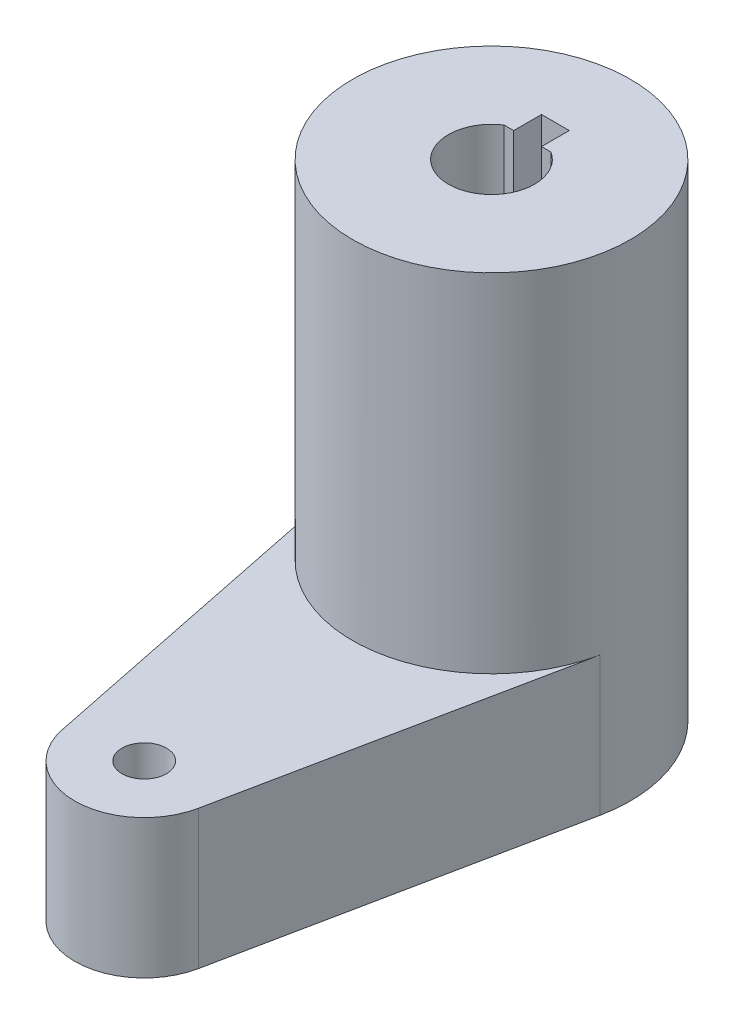
ISO-10303-21;
HEADER;
FILE_DESCRIPTION(('STEP AP214'),'2;1');
FILE_NAME('part.step','',(''),(''),'','','');
FILE_SCHEMA(('AUTOMOTIVE_DESIGN { 1 0 10303 214 1 1 1 1 }'));
ENDSEC;
DATA;
#1=APPLICATION_CONTEXT('core data for automotive mechanical design processes');
#2=APPLICATION_PROTOCOL_DEFINITION('international standard','automotive_design',2000,#1);
#3=PRODUCT_CONTEXT('',#1,'mechanical');
#4=PRODUCT('Part','Part','',(#3));
#5=PRODUCT_RELATED_PRODUCT_CATEGORY('part','',(#4));
#6=PRODUCT_DEFINITION_FORMATION('','',#4);
#7=PRODUCT_DEFINITION_CONTEXT('part definition',#1,'design');
#8=PRODUCT_DEFINITION('design','',#6,#7);
#9=PRODUCT_DEFINITION_SHAPE('','',#8);
#10=(LENGTH_UNIT() NAMED_UNIT(*) SI_UNIT(.MILLI.,.METRE.));
#11=(NAMED_UNIT(*) PLANE_ANGLE_UNIT() SI_UNIT($,.RADIAN.));
#12=(NAMED_UNIT(*) SI_UNIT($,.STERADIAN.) SOLID_ANGLE_UNIT());
#13=UNCERTAINTY_MEASURE_WITH_UNIT(LENGTH_MEASURE(1.E-05),#10,'distance_accuracy_value','');
#14=(GEOMETRIC_REPRESENTATION_CONTEXT(3) GLOBAL_UNCERTAINTY_ASSIGNED_CONTEXT((#13)) GLOBAL_UNIT_ASSIGNED_CONTEXT((#10,
#11,#12)) REPRESENTATION_CONTEXT('',''));
#15=CARTESIAN_POINT('',(0.,0.,0.));
#16=DIRECTION('',(0.,0.,1.));
#17=DIRECTION('',(1.,0.,0.));
#18=AXIS2_PLACEMENT_3D('',#15,#16,#17);
#19=CARTESIAN_POINT('',(0.,10.,0.));
#20=DIRECTION('',(0.,1.,0.));
#21=DIRECTION('',(0.,0.,1.));
#22=AXIS2_PLACEMENT_3D('',#19,#20,#21);
#23=PLANE('',#22);
#24=CARTESIAN_POINT('',(0.,10.,0.));
#25=DIRECTION('',(0.,1.,0.));
#26=DIRECTION('',(0.,0.,1.));
#27=AXIS2_PLACEMENT_3D('',#24,#25,#26);
#28=CIRCLE('',#27,10.);
#29=CARTESIAN_POINT('',(-9.79795897113271,10.,2.));
#30=VERTEX_POINT('',#29);
#31=CARTESIAN_POINT('',(9.79795897113271,10.,2.));
#32=VERTEX_POINT('',#31);
#33=EDGE_CURVE('E214',#30,#32,#28,.T.);
#34=ORIENTED_EDGE('',*,*,#33,.F.);
#35=DIRECTION('',(0.2,0.,0.979795897113271));
#36=VECTOR('',#35,1.);
#37=CARTESIAN_POINT('',(-9.79795897113271,10.,2.));
#38=LINE('',#37,#36);
#39=CARTESIAN_POINT('',(-4.89897948556636,10.,26.));
#40=VERTEX_POINT('',#39);
#41=EDGE_CURVE('E225',#30,#40,#38,.T.);
#42=ORIENTED_EDGE('',*,*,#41,.T.);
#43=CARTESIAN_POINT('',(0.,10.,25.));
#44=DIRECTION('',(0.,1.,0.));
#45=DIRECTION('',(0.,0.,1.));
#46=AXIS2_PLACEMENT_3D('',#43,#44,#45);
#47=CIRCLE('',#46,5.);
#48=CARTESIAN_POINT('',(4.89897948556635,10.,26.));
#49=VERTEX_POINT('',#48);
#50=EDGE_CURVE('E227',#40,#49,#47,.T.);
#51=ORIENTED_EDGE('',*,*,#50,.T.);
#52=DIRECTION('',(0.2,0.,-0.979795897113271));
#53=VECTOR('',#52,1.);
#54=CARTESIAN_POINT('',(4.89897948556636,10.,26.));
#55=LINE('',#54,#53);
#56=EDGE_CURVE('E230',#49,#32,#55,.T.);
#57=ORIENTED_EDGE('',*,*,#56,.T.);
#58=EDGE_LOOP('',(#34,#42,#51,#57));
#59=FACE_BOUND('',#58,.T.);
#60=CARTESIAN_POINT('',(0.,10.,25.));
#61=DIRECTION('',(0.,1.,0.));
#62=DIRECTION('',(0.,0.,1.));
#63=AXIS2_PLACEMENT_3D('',#60,#61,#62);
#64=CIRCLE('',#63,1.6);
#65=CARTESIAN_POINT('',(0.,10.,26.6));
#66=VERTEX_POINT('',#65);
#67=EDGE_CURVE('E219',#66,#66,#64,.T.);
#68=ORIENTED_EDGE('',*,*,#67,.F.);
#69=EDGE_LOOP('',(#68));
#70=FACE_BOUND('',#69,.T.);
#71=ADVANCED_FACE('F35',(#59,#70),#23,.T.);
#72=CARTESIAN_POINT('',(0.,0.,0.));
#73=DIRECTION('',(0.,1.,0.));
#74=DIRECTION('',(0.,0.,1.));
#75=AXIS2_PLACEMENT_3D('',#72,#73,#74);
#76=PLANE('',#75);
#77=DIRECTION('',(-1.,0.,0.));
#78=VECTOR('',#77,1.);
#79=CARTESIAN_POINT('',(1.,0.,-2.6));
#80=LINE('',#79,#78);
#81=CARTESIAN_POINT('',(1.68819430161341,0.,-2.6));
#82=VERTEX_POINT('',#81);
#83=CARTESIAN_POINT('',(1.212399911203,0.,-2.6));
#84=VERTEX_POINT('',#83);
#85=EDGE_CURVE('E195',#82,#84,#80,.T.);
#86=ORIENTED_EDGE('',*,*,#85,.T.);
#87=DIRECTION('',(-0.4226182617407,0.,0.90630778703665));
#88=VECTOR('',#87,1.);
#89=CARTESIAN_POINT('',(4.226182617407,0.,-9.0630778703665));
#90=LINE('',#89,#88);
#91=CARTESIAN_POINT('',(4.226182617407,0.,-9.0630778703665));
#92=VERTEX_POINT('',#91);
#93=EDGE_CURVE('E151',#92,#84,#90,.T.);
#94=ORIENTED_EDGE('',*,*,#93,.F.);
#95=CARTESIAN_POINT('',(0.,0.,0.));
#96=DIRECTION('',(0.,1.,0.));
#97=DIRECTION('',(0.,0.,1.));
#98=AXIS2_PLACEMENT_3D('',#95,#96,#97);
#99=CIRCLE('',#98,10.);
#100=CARTESIAN_POINT('',(9.79795897113271,0.,2.));
#101=VERTEX_POINT('',#100);
#102=EDGE_CURVE('E157',#101,#92,#99,.T.);
#103=ORIENTED_EDGE('',*,*,#102,.F.);
#104=DIRECTION('',(0.2,0.,-0.979795897113271));
#105=VECTOR('',#104,1.);
#106=CARTESIAN_POINT('',(4.89897948556636,0.,26.));
#107=LINE('',#106,#105);
#108=CARTESIAN_POINT('',(4.89897948556635,0.,26.));
#109=VERTEX_POINT('',#108);
#110=EDGE_CURVE('E228',#109,#101,#107,.T.);
#111=ORIENTED_EDGE('',*,*,#110,.F.);
#112=CARTESIAN_POINT('',(0.,0.,25.));
#113=DIRECTION('',(0.,1.,0.));
#114=DIRECTION('',(0.,0.,1.));
#115=AXIS2_PLACEMENT_3D('',#112,#113,#114);
#116=CIRCLE('',#115,5.);
#117=CARTESIAN_POINT('',(-4.89897948556636,0.,26.));
#118=VERTEX_POINT('',#117);
#119=EDGE_CURVE('E237',#118,#109,#116,.T.);
#120=ORIENTED_EDGE('',*,*,#119,.F.);
#121=DIRECTION('',(0.2,0.,0.979795897113271));
#122=VECTOR('',#121,1.);
#123=CARTESIAN_POINT('',(-9.79795897113271,0.,2.));
#124=LINE('',#123,#122);
#125=CARTESIAN_POINT('',(-9.79795897113271,0.,2.));
#126=VERTEX_POINT('',#125);
#127=EDGE_CURVE('E235',#126,#118,#124,.T.);
#128=ORIENTED_EDGE('',*,*,#127,.F.);
#129=CARTESIAN_POINT('',(-4.226182617407,0.,-9.0630778703665));
#130=VERTEX_POINT('',#129);
#131=EDGE_CURVE('E222',#130,#126,#99,.T.);
#132=ORIENTED_EDGE('',*,*,#131,.F.);
#133=DIRECTION('',(-0.4226182617407,0.,-0.90630778703665));
#134=VECTOR('',#133,1.);
#135=CARTESIAN_POINT('',(0.,0.,0.));
#136=LINE('',#135,#134);
#137=CARTESIAN_POINT('',(-1.212399911203,0.,-2.6));
#138=VERTEX_POINT('',#137);
#139=EDGE_CURVE('E324',#138,#130,#136,.T.);
#140=ORIENTED_EDGE('',*,*,#139,.F.);
#141=DIRECTION('',(-1.,0.,0.));
#142=VECTOR('',#141,1.);
#143=CARTESIAN_POINT('',(-1.68819430161341,0.,-2.6));
#144=LINE('',#143,#142);
#145=CARTESIAN_POINT('',(-1.68819430161341,0.,-2.6));
#146=VERTEX_POINT('',#145);
#147=EDGE_CURVE('E58',#138,#146,#144,.T.);
#148=ORIENTED_EDGE('',*,*,#147,.T.);
#149=CARTESIAN_POINT('',(0.,0.,0.));
#150=DIRECTION('',(0.,1.,0.));
#151=DIRECTION('',(0.,0.,1.));
#152=AXIS2_PLACEMENT_3D('',#149,#150,#151);
#153=CIRCLE('',#152,3.1);
#154=EDGE_CURVE('E193',#146,#82,#153,.T.);
#155=ORIENTED_EDGE('',*,*,#154,.T.);
#156=EDGE_LOOP('',(#86,#94,#103,#111,#120,#128,#132,#140,#148,#155));
#157=FACE_BOUND('',#156,.T.);
#158=CARTESIAN_POINT('',(0.,0.,25.));
#159=DIRECTION('',(0.,1.,0.));
#160=DIRECTION('',(0.,0.,1.));
#161=AXIS2_PLACEMENT_3D('',#158,#159,#160);
#162=CIRCLE('',#161,1.6);
#163=CARTESIAN_POINT('',(0.,0.,26.6));
#164=VERTEX_POINT('',#163);
#165=EDGE_CURVE('E213',#164,#164,#162,.T.);
#166=ORIENTED_EDGE('',*,*,#165,.T.);
#167=EDGE_LOOP('',(#166));
#168=FACE_BOUND('',#167,.T.);
#169=ADVANCED_FACE('F269',(#157,#168),#76,.F.);
#170=CARTESIAN_POINT('',(0.,10.,0.));
#171=DIRECTION('',(0.,-1.,0.));
#172=DIRECTION('',(0.,0.,-1.));
#173=AXIS2_PLACEMENT_3D('',#170,#171,#172);
#174=CYLINDRICAL_SURFACE('',#173,10.);
#175=ORIENTED_EDGE('',*,*,#102,.T.);
#176=DIRECTION('',(0.,-1.,0.));
#177=VECTOR('',#176,1.);
#178=CARTESIAN_POINT('',(4.226182617407,48.0936044717523,-9.0630778703665));
#179=LINE('',#178,#177);
#180=CARTESIAN_POINT('',(4.226182617407,25.,-9.0630778703665));
#181=VERTEX_POINT('',#180);
#182=EDGE_CURVE('E141',#181,#92,#179,.T.);
#183=ORIENTED_EDGE('',*,*,#182,.F.);
#184=CARTESIAN_POINT('',(0.,25.,0.));
#185=DIRECTION('',(0.,1.,0.));
#186=DIRECTION('',(0.,0.,1.));
#187=AXIS2_PLACEMENT_3D('',#184,#185,#186);
#188=CIRCLE('',#187,10.);
#189=CARTESIAN_POINT('',(-4.226182617407,25.,-9.0630778703665));
#190=VERTEX_POINT('',#189);
#191=EDGE_CURVE('E147',#190,#181,#188,.F.);
#192=ORIENTED_EDGE('',*,*,#191,.F.);
#193=DIRECTION('',(0.,-1.,0.));
#194=VECTOR('',#193,1.);
#195=CARTESIAN_POINT('',(-4.226182617407,48.0936044717523,-9.0630778703665));
#196=LINE('',#195,#194);
#197=EDGE_CURVE('E161',#190,#130,#196,.T.);
#198=ORIENTED_EDGE('',*,*,#197,.T.);
#199=ORIENTED_EDGE('',*,*,#131,.T.);
#200=DIRECTION('',(0.,-1.,0.));
#201=VECTOR('',#200,1.);
#202=CARTESIAN_POINT('',(-9.79795897113271,10.,2.));
#203=LINE('',#202,#201);
#204=EDGE_CURVE('E218',#30,#126,#203,.T.);
#205=ORIENTED_EDGE('',*,*,#204,.F.);
#206=ORIENTED_EDGE('',*,*,#33,.T.);
#207=DIRECTION('',(0.,-1.,0.));
#208=VECTOR('',#207,1.);
#209=CARTESIAN_POINT('',(9.79795897113271,10.,2.));
#210=LINE('',#209,#208);
#211=EDGE_CURVE('E233',#32,#101,#210,.T.);
#212=ORIENTED_EDGE('',*,*,#211,.T.);
#213=EDGE_LOOP('',(#175,#183,#192,#198,#199,#205,#206,#212));
#214=FACE_BOUND('',#213,.T.);
#215=CARTESIAN_POINT('',(0.,35.,0.));
#216=DIRECTION('',(0.,1.,0.));
#217=DIRECTION('',(0.,0.,1.));
#218=AXIS2_PLACEMENT_3D('',#215,#216,#217);
#219=CIRCLE('',#218,10.);
#220=CARTESIAN_POINT('',(0.,35.,10.));
#221=VERTEX_POINT('',#220);
#222=EDGE_CURVE('E201',#221,#221,#219,.T.);
#223=ORIENTED_EDGE('',*,*,#222,.F.);
#224=EDGE_LOOP('',(#223));
#225=FACE_BOUND('',#224,.T.);
#226=ADVANCED_FACE('F37',(#214,#225),#174,.T.);
#227=CARTESIAN_POINT('',(-9.79795897113271,10.,2.));
#228=DIRECTION('',(0.979795897113271,0.,-0.2));
#229=DIRECTION('',(-0.2,0.,-0.979795897113271));
#230=AXIS2_PLACEMENT_3D('',#227,#228,#229);
#231=PLANE('',#230);
#232=ORIENTED_EDGE('',*,*,#127,.T.);
#233=DIRECTION('',(0.,-1.,0.));
#234=VECTOR('',#233,1.);
#235=CARTESIAN_POINT('',(-4.89897948556636,10.,26.));
#236=LINE('',#235,#234);
#237=EDGE_CURVE('E244',#40,#118,#236,.T.);
#238=ORIENTED_EDGE('',*,*,#237,.F.);
#239=ORIENTED_EDGE('',*,*,#41,.F.);
#240=ORIENTED_EDGE('',*,*,#204,.T.);
#241=EDGE_LOOP('',(#232,#238,#239,#240));
#242=FACE_BOUND('',#241,.T.);
#243=ADVANCED_FACE('F307',(#242),#231,.F.);
#244=CARTESIAN_POINT('',(0.,10.,25.));
#245=DIRECTION('',(0.,-1.,0.));
#246=DIRECTION('',(0.,0.,-1.));
#247=AXIS2_PLACEMENT_3D('',#244,#245,#246);
#248=CYLINDRICAL_SURFACE('',#247,5.);
#249=ORIENTED_EDGE('',*,*,#119,.T.);
#250=DIRECTION('',(0.,-1.,0.));
#251=VECTOR('',#250,1.);
#252=CARTESIAN_POINT('',(4.89897948556635,10.,26.));
#253=LINE('',#252,#251);
#254=EDGE_CURVE('E241',#49,#109,#253,.T.);
#255=ORIENTED_EDGE('',*,*,#254,.F.);
#256=ORIENTED_EDGE('',*,*,#50,.F.);
#257=ORIENTED_EDGE('',*,*,#237,.T.);
#258=EDGE_LOOP('',(#249,#255,#256,#257));
#259=FACE_BOUND('',#258,.T.);
#260=ADVANCED_FACE('F304',(#259),#248,.T.);
#261=CARTESIAN_POINT('',(4.89897948556636,10.,26.));
#262=DIRECTION('',(-0.979795897113271,0.,-0.2));
#263=DIRECTION('',(-0.2,0.,0.979795897113271));
#264=AXIS2_PLACEMENT_3D('',#261,#262,#263);
#265=PLANE('',#264);
#266=ORIENTED_EDGE('',*,*,#110,.T.);
#267=ORIENTED_EDGE('',*,*,#211,.F.);
#268=ORIENTED_EDGE('',*,*,#56,.F.);
#269=ORIENTED_EDGE('',*,*,#254,.T.);
#270=EDGE_LOOP('',(#266,#267,#268,#269));
#271=FACE_BOUND('',#270,.T.);
#272=ADVANCED_FACE('F301',(#271),#265,.F.);
#273=CARTESIAN_POINT('',(0.,10.,25.));
#274=DIRECTION('',(0.,-1.,0.));
#275=DIRECTION('',(0.,0.,-1.));
#276=AXIS2_PLACEMENT_3D('',#273,#274,#275);
#277=CYLINDRICAL_SURFACE('',#276,1.6);
#278=ORIENTED_EDGE('',*,*,#67,.T.);
#279=EDGE_LOOP('',(#278));
#280=FACE_BOUND('',#279,.T.);
#281=ORIENTED_EDGE('',*,*,#165,.F.);
#282=EDGE_LOOP('',(#281));
#283=FACE_BOUND('',#282,.T.);
#284=ADVANCED_FACE('F298',(#280,#283),#277,.F.);
#285=CARTESIAN_POINT('',(0.,35.,0.));
#286=DIRECTION('',(0.,1.,0.));
#287=DIRECTION('',(0.,0.,1.));
#288=AXIS2_PLACEMENT_3D('',#285,#286,#287);
#289=PLANE('',#288);
#290=DIRECTION('',(0.,0.,1.));
#291=VECTOR('',#290,1.);
#292=CARTESIAN_POINT('',(-1.,35.,-2.6));
#293=LINE('',#292,#291);
#294=CARTESIAN_POINT('',(-1.,35.,-4.6));
#295=VERTEX_POINT('',#294);
#296=CARTESIAN_POINT('',(-1.,35.,-2.6));
#297=VERTEX_POINT('',#296);
#298=EDGE_CURVE('E174',#295,#297,#293,.T.);
#299=ORIENTED_EDGE('',*,*,#298,.F.);
#300=DIRECTION('',(-1.,0.,0.));
#301=VECTOR('',#300,1.);
#302=CARTESIAN_POINT('',(-1.,35.,-4.6));
#303=LINE('',#302,#301);
#304=CARTESIAN_POINT('',(1.,35.,-4.6));
#305=VERTEX_POINT('',#304);
#306=EDGE_CURVE('E189',#305,#295,#303,.T.);
#307=ORIENTED_EDGE('',*,*,#306,.F.);
#308=DIRECTION('',(0.,0.,-1.));
#309=VECTOR('',#308,1.);
#310=CARTESIAN_POINT('',(1.,35.,-2.6));
#311=LINE('',#310,#309);
#312=CARTESIAN_POINT('',(1.,35.,-2.6));
#313=VERTEX_POINT('',#312);
#314=EDGE_CURVE('E186',#313,#305,#311,.T.);
#315=ORIENTED_EDGE('',*,*,#314,.F.);
#316=DIRECTION('',(-1.,0.,0.));
#317=VECTOR('',#316,1.);
#318=CARTESIAN_POINT('',(1.,35.,-2.6));
#319=LINE('',#318,#317);
#320=CARTESIAN_POINT('',(1.68819430161341,35.,-2.6));
#321=VERTEX_POINT('',#320);
#322=EDGE_CURVE('E183',#321,#313,#319,.T.);
#323=ORIENTED_EDGE('',*,*,#322,.F.);
#324=CARTESIAN_POINT('',(0.,35.,0.));
#325=DIRECTION('',(0.,1.,0.));
#326=DIRECTION('',(0.,0.,1.));
#327=AXIS2_PLACEMENT_3D('',#324,#325,#326);
#328=CIRCLE('',#327,3.1);
#329=CARTESIAN_POINT('',(-1.68819430161341,35.,-2.6));
#330=VERTEX_POINT('',#329);
#331=EDGE_CURVE('E180',#330,#321,#328,.T.);
#332=ORIENTED_EDGE('',*,*,#331,.F.);
#333=DIRECTION('',(-1.,0.,0.));
#334=VECTOR('',#333,1.);
#335=CARTESIAN_POINT('',(-1.68819430161341,35.,-2.6));
#336=LINE('',#335,#334);
#337=EDGE_CURVE('E177',#297,#330,#336,.T.);
#338=ORIENTED_EDGE('',*,*,#337,.F.);
#339=EDGE_LOOP('',(#299,#307,#315,#323,#332,#338));
#340=FACE_BOUND('',#339,.T.);
#341=ORIENTED_EDGE('',*,*,#222,.T.);
#342=EDGE_LOOP('',(#341));
#343=FACE_BOUND('',#342,.T.);
#344=ADVANCED_FACE('F262',(#340,#343),#289,.T.);
#345=CARTESIAN_POINT('',(-1.,0.,-2.6));
#346=DIRECTION('',(-1.,0.,0.));
#347=DIRECTION('',(0.,0.,1.));
#348=AXIS2_PLACEMENT_3D('',#345,#346,#347);
#349=PLANE('',#348);
#350=DIRECTION('',(0.,1.,0.));
#351=VECTOR('',#350,1.);
#352=CARTESIAN_POINT('',(-1.,0.,-2.6));
#353=LINE('',#352,#351);
#354=CARTESIAN_POINT('',(-1.,25.,-2.6));
#355=VERTEX_POINT('',#354);
#356=EDGE_CURVE('E198',#355,#297,#353,.T.);
#357=ORIENTED_EDGE('',*,*,#356,.F.);
#358=DIRECTION('',(0.,0.,-1.));
#359=VECTOR('',#358,1.);
#360=CARTESIAN_POINT('',(-1.,25.,-2.6));
#361=LINE('',#360,#359);
#362=CARTESIAN_POINT('',(-1.,25.,-4.6));
#363=VERTEX_POINT('',#362);
#364=EDGE_CURVE('E163',#355,#363,#361,.T.);
#365=ORIENTED_EDGE('',*,*,#364,.T.);
#366=DIRECTION('',(0.,1.,0.));
#367=VECTOR('',#366,1.);
#368=CARTESIAN_POINT('',(-1.,0.,-4.6));
#369=LINE('',#368,#367);
#370=EDGE_CURVE('E199',#363,#295,#369,.T.);
#371=ORIENTED_EDGE('',*,*,#370,.T.);
#372=ORIENTED_EDGE('',*,*,#298,.T.);
#373=EDGE_LOOP('',(#357,#365,#371,#372));
#374=FACE_BOUND('',#373,.T.);
#375=ADVANCED_FACE('F255',(#374),#349,.F.);
#376=CARTESIAN_POINT('',(-1.,0.,-4.6));
#377=DIRECTION('',(0.,0.,-1.));
#378=DIRECTION('',(-1.,0.,0.));
#379=AXIS2_PLACEMENT_3D('',#376,#377,#378);
#380=PLANE('',#379);
#381=ORIENTED_EDGE('',*,*,#370,.F.);
#382=DIRECTION('',(1.,0.,0.));
#383=VECTOR('',#382,1.);
#384=CARTESIAN_POINT('',(-1.,25.,-4.6));
#385=LINE('',#384,#383);
#386=CARTESIAN_POINT('',(1.,25.,-4.6));
#387=VERTEX_POINT('',#386);
#388=EDGE_CURVE('E166',#363,#387,#385,.T.);
#389=ORIENTED_EDGE('',*,*,#388,.T.);
#390=DIRECTION('',(0.,1.,0.));
#391=VECTOR('',#390,1.);
#392=CARTESIAN_POINT('',(1.,0.,-4.6));
#393=LINE('',#392,#391);
#394=EDGE_CURVE('E202',#387,#305,#393,.T.);
#395=ORIENTED_EDGE('',*,*,#394,.T.);
#396=ORIENTED_EDGE('',*,*,#306,.T.);
#397=EDGE_LOOP('',(#381,#389,#395,#396));
#398=FACE_BOUND('',#397,.T.);
#399=ADVANCED_FACE('F279',(#398),#380,.F.);
#400=CARTESIAN_POINT('',(1.,0.,-2.6));
#401=DIRECTION('',(1.,0.,0.));
#402=DIRECTION('',(0.,0.,-1.));
#403=AXIS2_PLACEMENT_3D('',#400,#401,#402);
#404=PLANE('',#403);
#405=ORIENTED_EDGE('',*,*,#394,.F.);
#406=DIRECTION('',(0.,0.,1.));
#407=VECTOR('',#406,1.);
#408=CARTESIAN_POINT('',(1.,25.,-2.6));
#409=LINE('',#408,#407);
#410=CARTESIAN_POINT('',(1.,25.,-2.6));
#411=VERTEX_POINT('',#410);
#412=EDGE_CURVE('E169',#387,#411,#409,.T.);
#413=ORIENTED_EDGE('',*,*,#412,.T.);
#414=DIRECTION('',(0.,1.,0.));
#415=VECTOR('',#414,1.);
#416=CARTESIAN_POINT('',(1.,0.,-2.6));
#417=LINE('',#416,#415);
#418=EDGE_CURVE('E204',#411,#313,#417,.T.);
#419=ORIENTED_EDGE('',*,*,#418,.T.);
#420=ORIENTED_EDGE('',*,*,#314,.T.);
#421=EDGE_LOOP('',(#405,#413,#419,#420));
#422=FACE_BOUND('',#421,.T.);
#423=ADVANCED_FACE('F276',(#422),#404,.F.);
#424=CARTESIAN_POINT('',(1.,0.,-2.6));
#425=DIRECTION('',(0.,0.,-1.));
#426=DIRECTION('',(-1.,0.,0.));
#427=AXIS2_PLACEMENT_3D('',#424,#425,#426);
#428=PLANE('',#427);
#429=ORIENTED_EDGE('',*,*,#418,.F.);
#430=DIRECTION('',(1.,0.,0.));
#431=VECTOR('',#430,1.);
#432=CARTESIAN_POINT('',(1.,25.,-2.6));
#433=LINE('',#432,#431);
#434=CARTESIAN_POINT('',(1.212399911203,25.,-2.6));
#435=VERTEX_POINT('',#434);
#436=EDGE_CURVE('E172',#411,#435,#433,.T.);
#437=ORIENTED_EDGE('',*,*,#436,.T.);
#438=DIRECTION('',(0.,-1.,0.));
#439=VECTOR('',#438,1.);
#440=CARTESIAN_POINT('',(1.212399911203,0.,-2.6));
#441=LINE('',#440,#439);
#442=EDGE_CURVE('E12',#435,#84,#441,.T.);
#443=ORIENTED_EDGE('',*,*,#442,.T.);
#444=ORIENTED_EDGE('',*,*,#85,.F.);
#445=DIRECTION('',(0.,1.,0.));
#446=VECTOR('',#445,1.);
#447=CARTESIAN_POINT('',(1.68819430161341,0.,-2.6));
#448=LINE('',#447,#446);
#449=EDGE_CURVE('E206',#82,#321,#448,.T.);
#450=ORIENTED_EDGE('',*,*,#449,.T.);
#451=ORIENTED_EDGE('',*,*,#322,.T.);
#452=EDGE_LOOP('',(#429,#437,#443,#444,#450,#451));
#453=FACE_BOUND('',#452,.T.);
#454=ADVANCED_FACE('F273',(#453),#428,.F.);
#455=CARTESIAN_POINT('',(0.,0.,0.));
#456=DIRECTION('',(0.,1.,0.));
#457=DIRECTION('',(0.,0.,1.));
#458=AXIS2_PLACEMENT_3D('',#455,#456,#457);
#459=CYLINDRICAL_SURFACE('',#458,3.1);
#460=ORIENTED_EDGE('',*,*,#449,.F.);
#461=ORIENTED_EDGE('',*,*,#154,.F.);
#462=DIRECTION('',(0.,1.,0.));
#463=VECTOR('',#462,1.);
#464=CARTESIAN_POINT('',(-1.68819430161341,0.,-2.6));
#465=LINE('',#464,#463);
#466=EDGE_CURVE('E208',#146,#330,#465,.T.);
#467=ORIENTED_EDGE('',*,*,#466,.T.);
#468=ORIENTED_EDGE('',*,*,#331,.T.);
#469=EDGE_LOOP('',(#460,#461,#467,#468));
#470=FACE_BOUND('',#469,.T.);
#471=ADVANCED_FACE('F267',(#470),#459,.F.);
#472=CARTESIAN_POINT('',(-1.68819430161341,0.,-2.6));
#473=DIRECTION('',(0.,0.,-1.));
#474=DIRECTION('',(-1.,0.,0.));
#475=AXIS2_PLACEMENT_3D('',#472,#473,#474);
#476=PLANE('',#475);
#477=DIRECTION('',(0.,1.,0.));
#478=VECTOR('',#477,1.);
#479=CARTESIAN_POINT('',(-1.212399911203,0.,-2.6));
#480=LINE('',#479,#478);
#481=CARTESIAN_POINT('',(-1.212399911203,25.,-2.6));
#482=VERTEX_POINT('',#481);
#483=EDGE_CURVE('E217',#138,#482,#480,.T.);
#484=ORIENTED_EDGE('',*,*,#483,.T.);
#485=DIRECTION('',(1.,0.,0.));
#486=VECTOR('',#485,1.);
#487=CARTESIAN_POINT('',(-1.68819430161341,25.,-2.6));
#488=LINE('',#487,#486);
#489=EDGE_CURVE('E43',#482,#355,#488,.T.);
#490=ORIENTED_EDGE('',*,*,#489,.T.);
#491=ORIENTED_EDGE('',*,*,#356,.T.);
#492=ORIENTED_EDGE('',*,*,#337,.T.);
#493=ORIENTED_EDGE('',*,*,#466,.F.);
#494=ORIENTED_EDGE('',*,*,#147,.F.);
#495=EDGE_LOOP('',(#484,#490,#491,#492,#493,#494));
#496=FACE_BOUND('',#495,.T.);
#497=ADVANCED_FACE('F253',(#496),#476,.F.);
#498=CARTESIAN_POINT('',(4.226182617407,48.0936044717523,-9.0630778703665));
#499=DIRECTION('',(0.90630778703665,0.,0.4226182617407));
#500=DIRECTION('',(0.4226182617407,0.,-0.90630778703665));
#501=AXIS2_PLACEMENT_3D('',#498,#499,#500);
#502=PLANE('',#501);
#503=DIRECTION('',(-0.4226182617407,0.,0.90630778703665));
#504=VECTOR('',#503,1.);
#505=CARTESIAN_POINT('',(4.226182617407,25.,-9.0630778703665));
#506=LINE('',#505,#504);
#507=EDGE_CURVE('E137',#181,#435,#506,.T.);
#508=ORIENTED_EDGE('',*,*,#507,.F.);
#509=ORIENTED_EDGE('',*,*,#182,.T.);
#510=ORIENTED_EDGE('',*,*,#93,.T.);
#511=ORIENTED_EDGE('',*,*,#442,.F.);
#512=EDGE_LOOP('',(#508,#509,#510,#511));
#513=FACE_BOUND('',#512,.T.);
#514=ADVANCED_FACE('F139',(#513),#502,.F.);
#515=CARTESIAN_POINT('',(0.,25.,0.));
#516=DIRECTION('',(0.,1.,0.));
#517=DIRECTION('',(0.,0.,1.));
#518=AXIS2_PLACEMENT_3D('',#515,#516,#517);
#519=PLANE('',#518);
#520=ORIENTED_EDGE('',*,*,#412,.F.);
#521=ORIENTED_EDGE('',*,*,#388,.F.);
#522=ORIENTED_EDGE('',*,*,#364,.F.);
#523=ORIENTED_EDGE('',*,*,#489,.F.);
#524=DIRECTION('',(-0.4226182617407,0.,-0.90630778703665));
#525=VECTOR('',#524,1.);
#526=CARTESIAN_POINT('',(0.,25.,0.));
#527=LINE('',#526,#525);
#528=EDGE_CURVE('E50',#482,#190,#527,.T.);
#529=ORIENTED_EDGE('',*,*,#528,.T.);
#530=ORIENTED_EDGE('',*,*,#191,.T.);
#531=ORIENTED_EDGE('',*,*,#507,.T.);
#532=ORIENTED_EDGE('',*,*,#436,.F.);
#533=EDGE_LOOP('',(#520,#521,#522,#523,#529,#530,#531,#532));
#534=FACE_BOUND('',#533,.T.);
#535=ADVANCED_FACE('F148',(#534),#519,.F.);
#536=CARTESIAN_POINT('',(0.,48.0936044717523,0.));
#537=DIRECTION('',(-0.90630778703665,0.,0.4226182617407));
#538=DIRECTION('',(0.4226182617407,0.,0.90630778703665));
#539=AXIS2_PLACEMENT_3D('',#536,#537,#538);
#540=PLANE('',#539);
#541=ORIENTED_EDGE('',*,*,#139,.T.);
#542=ORIENTED_EDGE('',*,*,#197,.F.);
#543=ORIENTED_EDGE('',*,*,#528,.F.);
#544=ORIENTED_EDGE('',*,*,#483,.F.);
#545=EDGE_LOOP('',(#541,#542,#543,#544));
#546=FACE_BOUND('',#545,.T.);
#547=ADVANCED_FACE('F327',(#546),#540,.F.);
#548=CLOSED_SHELL('',(#71,#169,#226,#243,#260,#272,#284,#344,#375,#399,#423,#454,#471,#497,#514,
#535,#547));
#549=MANIFOLD_SOLID_BREP('B2',#548);
#550=ADVANCED_BREP_SHAPE_REPRESENTATION('',(#18,#549),#14);
#551=SHAPE_DEFINITION_REPRESENTATION(#9,#550);
ENDSEC;
END-ISO-10303-21;
